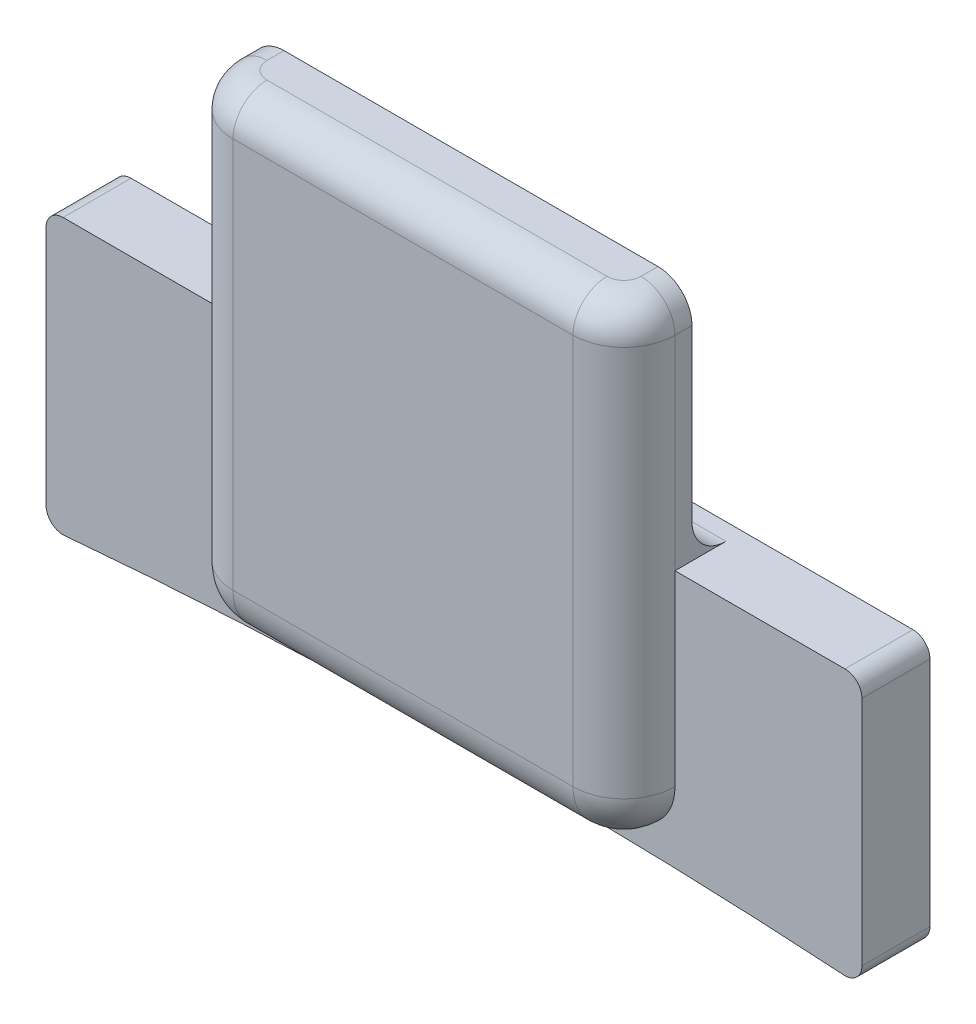
ISO-10303-21;
HEADER;
FILE_DESCRIPTION(('STEP AP214'),'2;1');
FILE_NAME('part.step','',(''),(''),'','','');
FILE_SCHEMA(('AUTOMOTIVE_DESIGN { 1 0 10303 214 1 1 1 1 }'));
ENDSEC;
DATA;
#1=APPLICATION_CONTEXT('core data for automotive mechanical design processes');
#2=APPLICATION_PROTOCOL_DEFINITION('international standard','automotive_design',2000,#1);
#3=PRODUCT_CONTEXT('',#1,'mechanical');
#4=PRODUCT('Part','Part','',(#3));
#5=PRODUCT_RELATED_PRODUCT_CATEGORY('part','',(#4));
#6=PRODUCT_DEFINITION_FORMATION('','',#4);
#7=PRODUCT_DEFINITION_CONTEXT('part definition',#1,'design');
#8=PRODUCT_DEFINITION('design','',#6,#7);
#9=PRODUCT_DEFINITION_SHAPE('','',#8);
#10=(LENGTH_UNIT() NAMED_UNIT(*) SI_UNIT(.MILLI.,.METRE.));
#11=(NAMED_UNIT(*) PLANE_ANGLE_UNIT() SI_UNIT($,.RADIAN.));
#12=(NAMED_UNIT(*) SI_UNIT($,.STERADIAN.) SOLID_ANGLE_UNIT());
#13=UNCERTAINTY_MEASURE_WITH_UNIT(LENGTH_MEASURE(1.E-05),#10,'distance_accuracy_value','');
#14=(GEOMETRIC_REPRESENTATION_CONTEXT(3) GLOBAL_UNCERTAINTY_ASSIGNED_CONTEXT((#13)) GLOBAL_UNIT_ASSIGNED_CONTEXT((#10,
#11,#12)) REPRESENTATION_CONTEXT('',''));
#15=CARTESIAN_POINT('',(0.,0.,0.));
#16=DIRECTION('',(0.,0.,1.));
#17=DIRECTION('',(1.,0.,0.));
#18=AXIS2_PLACEMENT_3D('',#15,#16,#17);
#19=CARTESIAN_POINT('',(-27.5000000737673,0.,4.));
#20=DIRECTION('',(0.,1.,0.));
#21=DIRECTION('',(-1.,0.,0.));
#22=AXIS2_PLACEMENT_3D('',#19,#20,#21);
#23=PLANE('',#22);
#24=DIRECTION('',(0.,0.,1.));
#25=VECTOR('',#24,1.);
#26=CARTESIAN_POINT('',(-16.5000000737673,0.,4.));
#27=LINE('',#26,#25);
#28=CARTESIAN_POINT('',(-16.5000000737673,0.,1.));
#29=VERTEX_POINT('',#28);
#30=CARTESIAN_POINT('',(-16.5000000737673,0.,4.));
#31=VERTEX_POINT('',#30);
#32=EDGE_CURVE('E49',#29,#31,#27,.T.);
#33=ORIENTED_EDGE('',*,*,#32,.F.);
#34=DIRECTION('',(-1.,0.,0.));
#35=VECTOR('',#34,1.);
#36=CARTESIAN_POINT('',(-27.5000000737673,0.,1.));
#37=LINE('',#36,#35);
#38=CARTESIAN_POINT('',(9.49999992623273,0.,0.999999999999993));
#39=VERTEX_POINT('',#38);
#40=EDGE_CURVE('E204',#29,#39,#37,.F.);
#41=ORIENTED_EDGE('',*,*,#40,.T.);
#42=DIRECTION('',(0.,0.,-1.));
#43=VECTOR('',#42,1.);
#44=CARTESIAN_POINT('',(9.49999992623272,0.,2.99999999999999));
#45=LINE('',#44,#43);
#46=CARTESIAN_POINT('',(9.49999992623272,0.,4.));
#47=VERTEX_POINT('',#46);
#48=EDGE_CURVE('E56',#47,#39,#45,.T.);
#49=ORIENTED_EDGE('',*,*,#48,.F.);
#50=DIRECTION('',(1.,0.,0.));
#51=VECTOR('',#50,1.);
#52=CARTESIAN_POINT('',(-27.5000000737673,0.,4.));
#53=LINE('',#52,#51);
#54=CARTESIAN_POINT('',(19.4999999262327,0.,4.));
#55=VERTEX_POINT('',#54);
#56=EDGE_CURVE('E184',#47,#55,#53,.T.);
#57=ORIENTED_EDGE('',*,*,#56,.T.);
#58=DIRECTION('',(0.,0.,-1.));
#59=VECTOR('',#58,1.);
#60=CARTESIAN_POINT('',(19.4999999262327,0.,4.));
#61=LINE('',#60,#59);
#62=CARTESIAN_POINT('',(19.4999999262327,0.,0.));
#63=VERTEX_POINT('',#62);
#64=EDGE_CURVE('E327',#55,#63,#61,.T.);
#65=ORIENTED_EDGE('',*,*,#64,.T.);
#66=DIRECTION('',(1.,0.,0.));
#67=VECTOR('',#66,1.);
#68=CARTESIAN_POINT('',(-27.5000000737673,0.,0.));
#69=LINE('',#68,#67);
#70=CARTESIAN_POINT('',(-26.5000000737673,0.,0.));
#71=VERTEX_POINT('',#70);
#72=EDGE_CURVE('E568',#71,#63,#69,.T.);
#73=ORIENTED_EDGE('',*,*,#72,.F.);
#74=DIRECTION('',(0.,0.,-1.));
#75=VECTOR('',#74,1.);
#76=CARTESIAN_POINT('',(-26.5000000737673,0.,4.));
#77=LINE('',#76,#75);
#78=CARTESIAN_POINT('',(-26.5000000737673,0.,4.));
#79=VERTEX_POINT('',#78);
#80=EDGE_CURVE('E330',#71,#79,#77,.F.);
#81=ORIENTED_EDGE('',*,*,#80,.T.);
#82=EDGE_CURVE('E194',#79,#31,#53,.T.);
#83=ORIENTED_EDGE('',*,*,#82,.T.);
#84=EDGE_LOOP('',(#33,#41,#49,#57,#65,#73,#81,#83));
#85=FACE_BOUND('',#84,.T.);
#86=ADVANCED_FACE('F34',(#85),#23,.T.);
#87=CARTESIAN_POINT('',(-1.09287578986539E-12,-315.000000000012,4.));
#88=DIRECTION('',(0.,0.,-1.));
#89=DIRECTION('',(-1.,0.,0.));
#90=AXIS2_PLACEMENT_3D('',#87,#88,#89);
#91=CYLINDRICAL_SURFACE('',#90,299.999999999988);
#92=CARTESIAN_POINT('',(-1.09287578986539E-12,-315.000000000012,0.));
#93=DIRECTION('',(0.,0.,1.));
#94=DIRECTION('',(1.,0.,0.));
#95=AXIS2_PLACEMENT_3D('',#92,#93,#94);
#96=CIRCLE('',#95,299.999999999988);
#97=CARTESIAN_POINT('',(19.4352158733216,-15.6302079635571,0.));
#98=VERTEX_POINT('',#97);
#99=CARTESIAN_POINT('',(-26.4119602064126,-16.1649144460432,0.));
#100=VERTEX_POINT('',#99);
#101=EDGE_CURVE('E200',#98,#100,#96,.T.);
#102=ORIENTED_EDGE('',*,*,#101,.F.);
#103=DIRECTION('',(0.,0.,-1.));
#104=VECTOR('',#103,1.);
#105=CARTESIAN_POINT('',(19.4352158733216,-15.6302079635571,4.));
#106=LINE('',#105,#104);
#107=CARTESIAN_POINT('',(19.4352158733216,-15.6302079635571,4.));
#108=VERTEX_POINT('',#107);
#109=EDGE_CURVE('E585',#98,#108,#106,.F.);
#110=ORIENTED_EDGE('',*,*,#109,.T.);
#111=CARTESIAN_POINT('',(-1.09287578986539E-12,-315.000000000012,4.));
#112=DIRECTION('',(0.,0.,1.));
#113=DIRECTION('',(1.,0.,0.));
#114=AXIS2_PLACEMENT_3D('',#111,#112,#113);
#115=CIRCLE('',#114,299.999999999988);
#116=CARTESIAN_POINT('',(-26.4119602064126,-16.1649144460432,4.));
#117=VERTEX_POINT('',#116);
#118=EDGE_CURVE('E263',#108,#117,#115,.T.);
#119=ORIENTED_EDGE('',*,*,#118,.T.);
#120=DIRECTION('',(0.,0.,-1.));
#121=VECTOR('',#120,1.);
#122=CARTESIAN_POINT('',(-26.4119602064126,-16.1649144460431,4.));
#123=LINE('',#122,#121);
#124=EDGE_CURVE('E613',#117,#100,#123,.T.);
#125=ORIENTED_EDGE('',*,*,#124,.T.);
#126=EDGE_LOOP('',(#102,#110,#119,#125));
#127=FACE_BOUND('',#126,.T.);
#128=ADVANCED_FACE('F358',(#127),#91,.F.);
#129=CARTESIAN_POINT('',(20.4999999262327,0.,4.));
#130=DIRECTION('',(1.,0.,0.));
#131=DIRECTION('',(0.,1.,0.));
#132=AXIS2_PLACEMENT_3D('',#129,#130,#131);
#133=PLANE('',#132);
#134=DIRECTION('',(0.,-1.,0.));
#135=VECTOR('',#134,1.);
#136=CARTESIAN_POINT('',(20.4999999262327,0.,4.));
#137=LINE('',#136,#135);
#138=CARTESIAN_POINT('',(20.4999999262327,-1.,4.));
#139=VERTEX_POINT('',#138);
#140=CARTESIAN_POINT('',(20.4999999262327,-14.6323086567688,4.));
#141=VERTEX_POINT('',#140);
#142=EDGE_CURVE('E579',#139,#141,#137,.T.);
#143=ORIENTED_EDGE('',*,*,#142,.T.);
#144=DIRECTION('',(0.,0.,-1.));
#145=VECTOR('',#144,1.);
#146=CARTESIAN_POINT('',(20.4999999262327,-14.6323086567688,4.));
#147=LINE('',#146,#145);
#148=CARTESIAN_POINT('',(20.4999999262327,-14.6323086567688,0.));
#149=VERTEX_POINT('',#148);
#150=EDGE_CURVE('E621',#141,#149,#147,.T.);
#151=ORIENTED_EDGE('',*,*,#150,.T.);
#152=DIRECTION('',(0.,-1.,0.));
#153=VECTOR('',#152,1.);
#154=CARTESIAN_POINT('',(20.4999999262327,0.,0.));
#155=LINE('',#154,#153);
#156=CARTESIAN_POINT('',(20.4999999262327,-1.,0.));
#157=VERTEX_POINT('',#156);
#158=EDGE_CURVE('E559',#157,#149,#155,.T.);
#159=ORIENTED_EDGE('',*,*,#158,.F.);
#160=DIRECTION('',(0.,0.,-1.));
#161=VECTOR('',#160,1.);
#162=CARTESIAN_POINT('',(20.4999999262327,-1.,4.));
#163=LINE('',#162,#161);
#164=EDGE_CURVE('E623',#157,#139,#163,.F.);
#165=ORIENTED_EDGE('',*,*,#164,.T.);
#166=EDGE_LOOP('',(#143,#151,#159,#165));
#167=FACE_BOUND('',#166,.T.);
#168=ADVANCED_FACE('F365',(#167),#133,.T.);
#169=CARTESIAN_POINT('',(-27.5000000737673,-16.2630756067663,4.));
#170=DIRECTION('',(-1.,0.,0.));
#171=DIRECTION('',(0.,0.,1.));
#172=AXIS2_PLACEMENT_3D('',#169,#170,#171);
#173=PLANE('',#172);
#174=DIRECTION('',(0.,1.,0.));
#175=VECTOR('',#174,1.);
#176=CARTESIAN_POINT('',(-27.5000000737673,-16.2630756067663,0.));
#177=LINE('',#176,#175);
#178=CARTESIAN_POINT('',(-27.5000000737673,-15.1687974941966,0.));
#179=VERTEX_POINT('',#178);
#180=CARTESIAN_POINT('',(-27.5000000737673,-0.999999999999994,0.));
#181=VERTEX_POINT('',#180);
#182=EDGE_CURVE('E571',#179,#181,#177,.T.);
#183=ORIENTED_EDGE('',*,*,#182,.F.);
#184=DIRECTION('',(0.,0.,-1.));
#185=VECTOR('',#184,1.);
#186=CARTESIAN_POINT('',(-27.5000000737673,-15.1687974941966,4.));
#187=LINE('',#186,#185);
#188=CARTESIAN_POINT('',(-27.5000000737673,-15.1687974941966,4.));
#189=VERTEX_POINT('',#188);
#190=EDGE_CURVE('E597',#179,#189,#187,.F.);
#191=ORIENTED_EDGE('',*,*,#190,.T.);
#192=DIRECTION('',(0.,1.,0.));
#193=VECTOR('',#192,1.);
#194=CARTESIAN_POINT('',(-27.5000000737673,-16.2630756067663,4.));
#195=LINE('',#194,#193);
#196=CARTESIAN_POINT('',(-27.5000000737673,-0.999999999999994,4.));
#197=VERTEX_POINT('',#196);
#198=EDGE_CURVE('E195',#189,#197,#195,.T.);
#199=ORIENTED_EDGE('',*,*,#198,.T.);
#200=DIRECTION('',(0.,0.,-1.));
#201=VECTOR('',#200,1.);
#202=CARTESIAN_POINT('',(-27.5000000737673,-0.999999999999994,4.));
#203=LINE('',#202,#201);
#204=EDGE_CURVE('E594',#197,#181,#203,.T.);
#205=ORIENTED_EDGE('',*,*,#204,.T.);
#206=EDGE_LOOP('',(#183,#191,#199,#205));
#207=FACE_BOUND('',#206,.T.);
#208=ADVANCED_FACE('F371',(#207),#173,.T.);
#209=CARTESIAN_POINT('',(-1.09287578986539E-12,-315.000000000012,4.));
#210=DIRECTION('',(0.,0.,1.));
#211=DIRECTION('',(1.,0.,0.));
#212=AXIS2_PLACEMENT_3D('',#209,#210,#211);
#213=PLANE('',#212);
#214=ORIENTED_EDGE('',*,*,#118,.F.);
#215=CARTESIAN_POINT('',(19.4999999262327,-14.6323086567688,4.));
#216=DIRECTION('',(0.,0.,1.));
#217=DIRECTION('',(1.,0.,0.));
#218=AXIS2_PLACEMENT_3D('',#215,#216,#217);
#219=CIRCLE('',#218,1.);
#220=EDGE_CURVE('E592',#108,#141,#219,.T.);
#221=ORIENTED_EDGE('',*,*,#220,.T.);
#222=ORIENTED_EDGE('',*,*,#142,.F.);
#223=CARTESIAN_POINT('',(19.4999999262327,-1.,4.));
#224=DIRECTION('',(0.,0.,1.));
#225=DIRECTION('',(1.,0.,0.));
#226=AXIS2_PLACEMENT_3D('',#223,#224,#225);
#227=CIRCLE('',#226,1.);
#228=EDGE_CURVE('E191',#139,#55,#227,.T.);
#229=ORIENTED_EDGE('',*,*,#228,.T.);
#230=ORIENTED_EDGE('',*,*,#56,.F.);
#231=DIRECTION('',(0.,1.,0.));
#232=VECTOR('',#231,1.);
#233=CARTESIAN_POINT('',(9.49999992623272,0.,4.));
#234=LINE('',#233,#232);
#235=CARTESIAN_POINT('',(9.49999992623272,-11.,4.));
#236=VERTEX_POINT('',#235);
#237=EDGE_CURVE('E187',#236,#47,#234,.T.);
#238=ORIENTED_EDGE('',*,*,#237,.F.);
#239=CARTESIAN_POINT('',(6.49999992623272,-11.,4.));
#240=DIRECTION('',(0.,0.,1.));
#241=DIRECTION('',(1.,0.,0.));
#242=AXIS2_PLACEMENT_3D('',#239,#240,#241);
#243=CIRCLE('',#242,3.);
#244=CARTESIAN_POINT('',(6.49999992623272,-14.,4.));
#245=VERTEX_POINT('',#244);
#246=EDGE_CURVE('E215',#236,#245,#243,.F.);
#247=ORIENTED_EDGE('',*,*,#246,.T.);
#248=DIRECTION('',(1.,0.,0.));
#249=VECTOR('',#248,1.);
#250=CARTESIAN_POINT('',(9.49999992623272,-14.,4.));
#251=LINE('',#250,#249);
#252=CARTESIAN_POINT('',(-13.5000000737673,-14.,4.));
#253=VERTEX_POINT('',#252);
#254=EDGE_CURVE('E201',#253,#245,#251,.T.);
#255=ORIENTED_EDGE('',*,*,#254,.F.);
#256=CARTESIAN_POINT('',(-13.5000000737673,-11.,4.));
#257=DIRECTION('',(0.,0.,1.));
#258=DIRECTION('',(1.,0.,0.));
#259=AXIS2_PLACEMENT_3D('',#256,#257,#258);
#260=CIRCLE('',#259,3.);
#261=CARTESIAN_POINT('',(-16.5000000737673,-11.,4.));
#262=VERTEX_POINT('',#261);
#263=EDGE_CURVE('E269',#253,#262,#260,.F.);
#264=ORIENTED_EDGE('',*,*,#263,.T.);
#265=DIRECTION('',(0.,-1.,0.));
#266=VECTOR('',#265,1.);
#267=CARTESIAN_POINT('',(-16.5000000737673,-14.,4.));
#268=LINE('',#267,#266);
#269=EDGE_CURVE('E178',#31,#262,#268,.T.);
#270=ORIENTED_EDGE('',*,*,#269,.F.);
#271=ORIENTED_EDGE('',*,*,#82,.F.);
#272=CARTESIAN_POINT('',(-26.5000000737673,-0.999999999999994,4.));
#273=DIRECTION('',(0.,0.,1.));
#274=DIRECTION('',(1.,0.,0.));
#275=AXIS2_PLACEMENT_3D('',#272,#273,#274);
#276=CIRCLE('',#275,1.);
#277=EDGE_CURVE('E587',#79,#197,#276,.T.);
#278=ORIENTED_EDGE('',*,*,#277,.T.);
#279=ORIENTED_EDGE('',*,*,#198,.F.);
#280=CARTESIAN_POINT('',(-26.5000000737673,-15.1687974941966,4.));
#281=DIRECTION('',(0.,0.,1.));
#282=DIRECTION('',(1.,0.,0.));
#283=AXIS2_PLACEMENT_3D('',#280,#281,#282);
#284=CIRCLE('',#283,1.);
#285=EDGE_CURVE('E590',#189,#117,#284,.T.);
#286=ORIENTED_EDGE('',*,*,#285,.T.);
#287=EDGE_LOOP('',(#214,#221,#222,#229,#230,#238,#247,#255,#264,#270,#271,#278,#279,#286));
#288=FACE_BOUND('',#287,.T.);
#289=ADVANCED_FACE('F186',(#288),#213,.T.);
#290=CARTESIAN_POINT('',(-1.09287578986539E-12,-315.000000000012,0.));
#291=DIRECTION('',(0.,0.,1.));
#292=DIRECTION('',(1.,0.,0.));
#293=AXIS2_PLACEMENT_3D('',#290,#291,#292);
#294=PLANE('',#293);
#295=ORIENTED_EDGE('',*,*,#158,.T.);
#296=CARTESIAN_POINT('',(19.4999999262327,-14.6323086567688,0.));
#297=DIRECTION('',(0.,0.,1.));
#298=DIRECTION('',(1.,0.,0.));
#299=AXIS2_PLACEMENT_3D('',#296,#297,#298);
#300=CIRCLE('',#299,1.);
#301=EDGE_CURVE('E561',#149,#98,#300,.F.);
#302=ORIENTED_EDGE('',*,*,#301,.T.);
#303=ORIENTED_EDGE('',*,*,#101,.T.);
#304=CARTESIAN_POINT('',(-26.5000000737673,-15.1687974941966,0.));
#305=DIRECTION('',(0.,0.,1.));
#306=DIRECTION('',(1.,0.,0.));
#307=AXIS2_PLACEMENT_3D('',#304,#305,#306);
#308=CIRCLE('',#307,1.);
#309=EDGE_CURVE('E609',#100,#179,#308,.F.);
#310=ORIENTED_EDGE('',*,*,#309,.T.);
#311=ORIENTED_EDGE('',*,*,#182,.T.);
#312=CARTESIAN_POINT('',(-26.5000000737673,-0.999999999999994,0.));
#313=DIRECTION('',(0.,0.,1.));
#314=DIRECTION('',(1.,0.,0.));
#315=AXIS2_PLACEMENT_3D('',#312,#313,#314);
#316=CIRCLE('',#315,1.);
#317=EDGE_CURVE('E605',#181,#71,#316,.F.);
#318=ORIENTED_EDGE('',*,*,#317,.T.);
#319=ORIENTED_EDGE('',*,*,#72,.T.);
#320=CARTESIAN_POINT('',(19.4999999262327,-1.,0.));
#321=DIRECTION('',(0.,0.,1.));
#322=DIRECTION('',(1.,0.,0.));
#323=AXIS2_PLACEMENT_3D('',#320,#321,#322);
#324=CIRCLE('',#323,1.);
#325=EDGE_CURVE('E564',#63,#157,#324,.F.);
#326=ORIENTED_EDGE('',*,*,#325,.T.);
#327=EDGE_LOOP('',(#295,#302,#303,#310,#311,#318,#319,#326));
#328=FACE_BOUND('',#327,.T.);
#329=ADVANCED_FACE('F431',(#328),#294,.F.);
#330=CARTESIAN_POINT('',(0.,0.,7.));
#331=DIRECTION('',(0.,0.,-1.));
#332=DIRECTION('',(-1.,0.,0.));
#333=AXIS2_PLACEMENT_3D('',#330,#331,#332);
#334=PLANE('',#333);
#335=DIRECTION('',(0.,1.,0.));
#336=VECTOR('',#335,1.);
#337=CARTESIAN_POINT('',(6.49999992623272,0.,7.));
#338=LINE('',#337,#336);
#339=CARTESIAN_POINT('',(6.49999992623272,-11.,7.));
#340=VERTEX_POINT('',#339);
#341=CARTESIAN_POINT('',(6.49999992623272,12.,7.));
#342=VERTEX_POINT('',#341);
#343=EDGE_CURVE('E321',#340,#342,#338,.T.);
#344=ORIENTED_EDGE('',*,*,#343,.T.);
#345=DIRECTION('',(1.,0.,0.));
#346=VECTOR('',#345,1.);
#347=CARTESIAN_POINT('',(0.,12.,7.));
#348=LINE('',#347,#346);
#349=CARTESIAN_POINT('',(-13.5000000737673,12.,7.));
#350=VERTEX_POINT('',#349);
#351=EDGE_CURVE('E228',#342,#350,#348,.F.);
#352=ORIENTED_EDGE('',*,*,#351,.T.);
#353=DIRECTION('',(0.,-1.,0.));
#354=VECTOR('',#353,1.);
#355=CARTESIAN_POINT('',(-13.5000000737673,0.,7.));
#356=LINE('',#355,#354);
#357=CARTESIAN_POINT('',(-13.5000000737673,-11.,7.));
#358=VERTEX_POINT('',#357);
#359=EDGE_CURVE('E301',#350,#358,#356,.T.);
#360=ORIENTED_EDGE('',*,*,#359,.T.);
#361=DIRECTION('',(1.,0.,0.));
#362=VECTOR('',#361,1.);
#363=CARTESIAN_POINT('',(0.,-11.,7.));
#364=LINE('',#363,#362);
#365=EDGE_CURVE('E326',#358,#340,#364,.T.);
#366=ORIENTED_EDGE('',*,*,#365,.T.);
#367=EDGE_LOOP('',(#344,#352,#360,#366));
#368=FACE_BOUND('',#367,.T.);
#369=ADVANCED_FACE('F324',(#368),#334,.F.);
#370=CARTESIAN_POINT('',(19.4999999262327,-14.6323086567688,4.));
#371=DIRECTION('',(0.,0.,-1.));
#372=DIRECTION('',(-1.,0.,0.));
#373=AXIS2_PLACEMENT_3D('',#370,#371,#372);
#374=CYLINDRICAL_SURFACE('',#373,1.);
#375=ORIENTED_EDGE('',*,*,#220,.F.);
#376=ORIENTED_EDGE('',*,*,#109,.F.);
#377=ORIENTED_EDGE('',*,*,#301,.F.);
#378=ORIENTED_EDGE('',*,*,#150,.F.);
#379=EDGE_LOOP('',(#375,#376,#377,#378));
#380=FACE_BOUND('',#379,.T.);
#381=ADVANCED_FACE('F375',(#380),#374,.T.);
#382=CARTESIAN_POINT('',(-26.5000000737673,-15.1687974941966,4.));
#383=DIRECTION('',(0.,0.,-1.));
#384=DIRECTION('',(-1.,0.,0.));
#385=AXIS2_PLACEMENT_3D('',#382,#383,#384);
#386=CYLINDRICAL_SURFACE('',#385,1.);
#387=ORIENTED_EDGE('',*,*,#285,.F.);
#388=ORIENTED_EDGE('',*,*,#190,.F.);
#389=ORIENTED_EDGE('',*,*,#309,.F.);
#390=ORIENTED_EDGE('',*,*,#124,.F.);
#391=EDGE_LOOP('',(#387,#388,#389,#390));
#392=FACE_BOUND('',#391,.T.);
#393=ADVANCED_FACE('F378',(#392),#386,.T.);
#394=CARTESIAN_POINT('',(19.4999999262327,-1.,4.));
#395=DIRECTION('',(0.,0.,-1.));
#396=DIRECTION('',(-1.,0.,0.));
#397=AXIS2_PLACEMENT_3D('',#394,#395,#396);
#398=CYLINDRICAL_SURFACE('',#397,1.);
#399=ORIENTED_EDGE('',*,*,#228,.F.);
#400=ORIENTED_EDGE('',*,*,#164,.F.);
#401=ORIENTED_EDGE('',*,*,#325,.F.);
#402=ORIENTED_EDGE('',*,*,#64,.F.);
#403=EDGE_LOOP('',(#399,#400,#401,#402));
#404=FACE_BOUND('',#403,.T.);
#405=ADVANCED_FACE('F382',(#404),#398,.T.);
#406=CARTESIAN_POINT('',(-26.5000000737673,-0.999999999999994,4.));
#407=DIRECTION('',(0.,0.,-1.));
#408=DIRECTION('',(-1.,0.,0.));
#409=AXIS2_PLACEMENT_3D('',#406,#407,#408);
#410=CYLINDRICAL_SURFACE('',#409,1.);
#411=ORIENTED_EDGE('',*,*,#277,.F.);
#412=ORIENTED_EDGE('',*,*,#80,.F.);
#413=ORIENTED_EDGE('',*,*,#317,.F.);
#414=ORIENTED_EDGE('',*,*,#204,.F.);
#415=EDGE_LOOP('',(#411,#412,#413,#414));
#416=FACE_BOUND('',#415,.T.);
#417=ADVANCED_FACE('F386',(#416),#410,.T.);
#418=CARTESIAN_POINT('',(-13.5000000737673,0.,4.));
#419=DIRECTION('',(0.,-1.,0.));
#420=DIRECTION('',(0.,0.,-1.));
#421=AXIS2_PLACEMENT_3D('',#418,#419,#420);
#422=CYLINDRICAL_SURFACE('',#421,3.);
#423=ORIENTED_EDGE('',*,*,#359,.F.);
#424=CARTESIAN_POINT('',(-13.5000000737673,12.,4.));
#425=DIRECTION('',(0.,-1.,0.));
#426=DIRECTION('',(1.,0.,0.));
#427=AXIS2_PLACEMENT_3D('',#424,#425,#426);
#428=CIRCLE('',#427,3.);
#429=CARTESIAN_POINT('',(-16.5000000737673,12.,4.));
#430=VERTEX_POINT('',#429);
#431=EDGE_CURVE('E223',#350,#430,#428,.T.);
#432=ORIENTED_EDGE('',*,*,#431,.T.);
#433=DIRECTION('',(0.,-1.,0.));
#434=VECTOR('',#433,1.);
#435=CARTESIAN_POINT('',(-16.5000000737673,14.,4.));
#436=LINE('',#435,#434);
#437=EDGE_CURVE('E255',#430,#31,#436,.T.);
#438=ORIENTED_EDGE('',*,*,#437,.T.);
#439=ORIENTED_EDGE('',*,*,#269,.T.);
#440=CARTESIAN_POINT('',(-13.5000000737673,-11.,4.));
#441=DIRECTION('',(0.,-1.,0.));
#442=DIRECTION('',(0.,0.,-1.));
#443=AXIS2_PLACEMENT_3D('',#440,#441,#442);
#444=CIRCLE('',#443,3.);
#445=EDGE_CURVE('E267',#262,#358,#444,.F.);
#446=ORIENTED_EDGE('',*,*,#445,.T.);
#447=EDGE_LOOP('',(#423,#432,#438,#439,#446));
#448=FACE_BOUND('',#447,.T.);
#449=ADVANCED_FACE('F299',(#448),#422,.T.);
#450=CARTESIAN_POINT('',(6.49999992623272,0.,4.));
#451=DIRECTION('',(0.,1.,0.));
#452=DIRECTION('',(-1.,0.,0.));
#453=AXIS2_PLACEMENT_3D('',#450,#451,#452);
#454=CYLINDRICAL_SURFACE('',#453,3.);
#455=DIRECTION('',(0.,-1.,0.));
#456=VECTOR('',#455,1.);
#457=CARTESIAN_POINT('',(9.49999992623272,14.,4.));
#458=LINE('',#457,#456);
#459=CARTESIAN_POINT('',(9.49999992623272,12.,4.));
#460=VERTEX_POINT('',#459);
#461=EDGE_CURVE('E169',#460,#47,#458,.T.);
#462=ORIENTED_EDGE('',*,*,#461,.F.);
#463=CARTESIAN_POINT('',(6.49999992623272,12.,4.));
#464=DIRECTION('',(0.,-1.,0.));
#465=DIRECTION('',(1.,0.,0.));
#466=AXIS2_PLACEMENT_3D('',#463,#464,#465);
#467=CIRCLE('',#466,3.);
#468=EDGE_CURVE('E226',#460,#342,#467,.T.);
#469=ORIENTED_EDGE('',*,*,#468,.T.);
#470=ORIENTED_EDGE('',*,*,#343,.F.);
#471=CARTESIAN_POINT('',(6.49999992623272,-11.,4.));
#472=DIRECTION('',(0.,1.,0.));
#473=DIRECTION('',(-1.,0.,0.));
#474=AXIS2_PLACEMENT_3D('',#471,#472,#473);
#475=CIRCLE('',#474,3.);
#476=EDGE_CURVE('E199',#340,#236,#475,.T.);
#477=ORIENTED_EDGE('',*,*,#476,.T.);
#478=ORIENTED_EDGE('',*,*,#237,.T.);
#479=EDGE_LOOP('',(#462,#469,#470,#477,#478));
#480=FACE_BOUND('',#479,.T.);
#481=ADVANCED_FACE('F197',(#480),#454,.T.);
#482=CARTESIAN_POINT('',(0.,-11.,4.));
#483=DIRECTION('',(1.,0.,0.));
#484=DIRECTION('',(0.,1.,0.));
#485=AXIS2_PLACEMENT_3D('',#482,#483,#484);
#486=CYLINDRICAL_SURFACE('',#485,3.);
#487=ORIENTED_EDGE('',*,*,#365,.F.);
#488=CARTESIAN_POINT('',(-13.5000000737673,-11.,4.));
#489=DIRECTION('',(1.,0.,0.));
#490=DIRECTION('',(0.,1.,0.));
#491=AXIS2_PLACEMENT_3D('',#488,#489,#490);
#492=CIRCLE('',#491,3.);
#493=EDGE_CURVE('E337',#358,#253,#492,.T.);
#494=ORIENTED_EDGE('',*,*,#493,.T.);
#495=ORIENTED_EDGE('',*,*,#254,.T.);
#496=CARTESIAN_POINT('',(6.49999992623272,-11.,4.));
#497=DIRECTION('',(1.,0.,0.));
#498=DIRECTION('',(0.,1.,0.));
#499=AXIS2_PLACEMENT_3D('',#496,#497,#498);
#500=CIRCLE('',#499,3.);
#501=EDGE_CURVE('E335',#245,#340,#500,.F.);
#502=ORIENTED_EDGE('',*,*,#501,.T.);
#503=EDGE_LOOP('',(#487,#494,#495,#502));
#504=FACE_BOUND('',#503,.T.);
#505=ADVANCED_FACE('F343',(#504),#486,.T.);
#506=CARTESIAN_POINT('',(-13.5000000737673,-11.,4.));
#507=DIRECTION('',(0.,0.,1.));
#508=DIRECTION('',(1.,0.,0.));
#509=AXIS2_PLACEMENT_3D('',#506,#507,#508);
#510=SPHERICAL_SURFACE('',#509,3.);
#511=ORIENTED_EDGE('',*,*,#493,.F.);
#512=ORIENTED_EDGE('',*,*,#445,.F.);
#513=ORIENTED_EDGE('',*,*,#263,.F.);
#514=EDGE_LOOP('',(#511,#512,#513));
#515=FACE_BOUND('',#514,.T.);
#516=ADVANCED_FACE('F345',(#515),#510,.T.);
#517=CARTESIAN_POINT('',(6.49999992623272,-11.,4.));
#518=DIRECTION('',(0.,0.,1.));
#519=DIRECTION('',(1.,0.,0.));
#520=AXIS2_PLACEMENT_3D('',#517,#518,#519);
#521=SPHERICAL_SURFACE('',#520,3.);
#522=ORIENTED_EDGE('',*,*,#246,.F.);
#523=ORIENTED_EDGE('',*,*,#476,.F.);
#524=ORIENTED_EDGE('',*,*,#501,.F.);
#525=EDGE_LOOP('',(#522,#523,#524));
#526=FACE_BOUND('',#525,.T.);
#527=ADVANCED_FACE('F347',(#526),#521,.T.);
#528=CARTESIAN_POINT('',(9.49999992623272,14.,2.99999999999999));
#529=DIRECTION('',(-1.,0.,0.));
#530=DIRECTION('',(0.,0.,1.));
#531=AXIS2_PLACEMENT_3D('',#528,#529,#530);
#532=PLANE('',#531);
#533=DIRECTION('',(0.,-1.,0.));
#534=VECTOR('',#533,1.);
#535=CARTESIAN_POINT('',(9.49999992623272,14.,2.99999999999999));
#536=LINE('',#535,#534);
#537=CARTESIAN_POINT('',(9.49999992623272,12.,2.99999999999999));
#538=VERTEX_POINT('',#537);
#539=CARTESIAN_POINT('',(9.49999992623272,2.,2.99999999999999));
#540=VERTEX_POINT('',#539);
#541=EDGE_CURVE('E179',#538,#540,#536,.T.);
#542=ORIENTED_EDGE('',*,*,#541,.F.);
#543=DIRECTION('',(0.,0.,-1.));
#544=VECTOR('',#543,1.);
#545=CARTESIAN_POINT('',(9.49999992623272,12.,2.99999999999999));
#546=LINE('',#545,#544);
#547=EDGE_CURVE('E174',#538,#460,#546,.F.);
#548=ORIENTED_EDGE('',*,*,#547,.T.);
#549=ORIENTED_EDGE('',*,*,#461,.T.);
#550=ORIENTED_EDGE('',*,*,#48,.T.);
#551=CARTESIAN_POINT('',(9.49999992623273,2.,0.999999999999993));
#552=DIRECTION('',(-1.,0.,0.));
#553=DIRECTION('',(0.,0.,1.));
#554=AXIS2_PLACEMENT_3D('',#551,#552,#553);
#555=CIRCLE('',#554,2.);
#556=EDGE_CURVE('E11',#39,#540,#555,.T.);
#557=ORIENTED_EDGE('',*,*,#556,.T.);
#558=EDGE_LOOP('',(#542,#548,#549,#550,#557));
#559=FACE_BOUND('',#558,.T.);
#560=ADVANCED_FACE('F172',(#559),#532,.F.);
#561=CARTESIAN_POINT('',(-16.5000000737673,14.,3.));
#562=DIRECTION('',(0.,0.,1.));
#563=DIRECTION('',(1.,0.,0.));
#564=AXIS2_PLACEMENT_3D('',#561,#562,#563);
#565=PLANE('',#564);
#566=ORIENTED_EDGE('',*,*,#541,.T.);
#567=DIRECTION('',(-1.,0.,0.));
#568=VECTOR('',#567,1.);
#569=CARTESIAN_POINT('',(-16.5000000737673,2.00000000000001,3.));
#570=LINE('',#569,#568);
#571=CARTESIAN_POINT('',(-16.5000000737673,2.00000000000001,3.));
#572=VERTEX_POINT('',#571);
#573=EDGE_CURVE('E230',#540,#572,#570,.T.);
#574=ORIENTED_EDGE('',*,*,#573,.T.);
#575=DIRECTION('',(0.,-1.,0.));
#576=VECTOR('',#575,1.);
#577=CARTESIAN_POINT('',(-16.5000000737673,14.,3.));
#578=LINE('',#577,#576);
#579=CARTESIAN_POINT('',(-16.5000000737673,12.,3.));
#580=VERTEX_POINT('',#579);
#581=EDGE_CURVE('E245',#580,#572,#578,.T.);
#582=ORIENTED_EDGE('',*,*,#581,.F.);
#583=CARTESIAN_POINT('',(-14.5000000737673,12.,3.));
#584=DIRECTION('',(0.,0.,1.));
#585=DIRECTION('',(1.,0.,0.));
#586=AXIS2_PLACEMENT_3D('',#583,#584,#585);
#587=CIRCLE('',#586,2.);
#588=CARTESIAN_POINT('',(-14.5000000737673,14.,3.));
#589=VERTEX_POINT('',#588);
#590=EDGE_CURVE('E293',#580,#589,#587,.F.);
#591=ORIENTED_EDGE('',*,*,#590,.T.);
#592=DIRECTION('',(-1.,0.,0.));
#593=VECTOR('',#592,1.);
#594=CARTESIAN_POINT('',(-16.5000000737673,14.,3.));
#595=LINE('',#594,#593);
#596=CARTESIAN_POINT('',(7.49999992623272,14.,2.99999999999999));
#597=VERTEX_POINT('',#596);
#598=EDGE_CURVE('E208',#597,#589,#595,.T.);
#599=ORIENTED_EDGE('',*,*,#598,.F.);
#600=CARTESIAN_POINT('',(7.49999992623272,12.,2.99999999999999));
#601=DIRECTION('',(0.,0.,1.));
#602=DIRECTION('',(1.,0.,0.));
#603=AXIS2_PLACEMENT_3D('',#600,#601,#602);
#604=CIRCLE('',#603,2.);
#605=EDGE_CURVE('E253',#597,#538,#604,.F.);
#606=ORIENTED_EDGE('',*,*,#605,.T.);
#607=EDGE_LOOP('',(#566,#574,#582,#591,#599,#606));
#608=FACE_BOUND('',#607,.T.);
#609=ADVANCED_FACE('F250',(#608),#565,.F.);
#610=CARTESIAN_POINT('',(-16.5000000737673,14.,4.));
#611=DIRECTION('',(1.,0.,0.));
#612=DIRECTION('',(0.,1.,0.));
#613=AXIS2_PLACEMENT_3D('',#610,#611,#612);
#614=PLANE('',#613);
#615=ORIENTED_EDGE('',*,*,#437,.F.);
#616=DIRECTION('',(0.,0.,1.));
#617=VECTOR('',#616,1.);
#618=CARTESIAN_POINT('',(-16.5000000737673,12.,4.));
#619=LINE('',#618,#617);
#620=EDGE_CURVE('E290',#430,#580,#619,.F.);
#621=ORIENTED_EDGE('',*,*,#620,.T.);
#622=ORIENTED_EDGE('',*,*,#581,.T.);
#623=CARTESIAN_POINT('',(-16.5000000737673,2.00000000000001,1.));
#624=DIRECTION('',(1.,0.,0.));
#625=DIRECTION('',(0.,1.,0.));
#626=AXIS2_PLACEMENT_3D('',#623,#624,#625);
#627=CIRCLE('',#626,2.);
#628=EDGE_CURVE('E42',#572,#29,#627,.T.);
#629=ORIENTED_EDGE('',*,*,#628,.T.);
#630=ORIENTED_EDGE('',*,*,#32,.T.);
#631=EDGE_LOOP('',(#615,#621,#622,#629,#630));
#632=FACE_BOUND('',#631,.T.);
#633=ADVANCED_FACE('F243',(#632),#614,.F.);
#634=CARTESIAN_POINT('',(6.49999992623272,14.,4.));
#635=DIRECTION('',(0.,-1.,0.));
#636=DIRECTION('',(1.,0.,0.));
#637=AXIS2_PLACEMENT_3D('',#634,#635,#636);
#638=PLANE('',#637);
#639=ORIENTED_EDGE('',*,*,#598,.T.);
#640=DIRECTION('',(0.,0.,1.));
#641=VECTOR('',#640,1.);
#642=CARTESIAN_POINT('',(-14.5000000737673,14.,4.));
#643=LINE('',#642,#641);
#644=CARTESIAN_POINT('',(-14.5000000737673,14.,4.));
#645=VERTEX_POINT('',#644);
#646=EDGE_CURVE('E287',#589,#645,#643,.T.);
#647=ORIENTED_EDGE('',*,*,#646,.T.);
#648=CARTESIAN_POINT('',(-13.5000000737673,14.,4.));
#649=DIRECTION('',(0.,-1.,0.));
#650=DIRECTION('',(1.,0.,0.));
#651=AXIS2_PLACEMENT_3D('',#648,#649,#650);
#652=CIRCLE('',#651,1.);
#653=CARTESIAN_POINT('',(-13.5000000737673,14.,5.));
#654=VERTEX_POINT('',#653);
#655=EDGE_CURVE('E285',#645,#654,#652,.F.);
#656=ORIENTED_EDGE('',*,*,#655,.T.);
#657=DIRECTION('',(1.,0.,0.));
#658=VECTOR('',#657,1.);
#659=CARTESIAN_POINT('',(6.49999992623272,14.,5.));
#660=LINE('',#659,#658);
#661=CARTESIAN_POINT('',(6.49999992623272,14.,5.));
#662=VERTEX_POINT('',#661);
#663=EDGE_CURVE('E273',#654,#662,#660,.T.);
#664=ORIENTED_EDGE('',*,*,#663,.T.);
#665=CARTESIAN_POINT('',(6.49999992623272,14.,4.));
#666=DIRECTION('',(0.,-1.,0.));
#667=DIRECTION('',(1.,0.,0.));
#668=AXIS2_PLACEMENT_3D('',#665,#666,#667);
#669=CIRCLE('',#668,1.);
#670=CARTESIAN_POINT('',(7.49999992623272,14.,4.));
#671=VERTEX_POINT('',#670);
#672=EDGE_CURVE('E274',#662,#671,#669,.F.);
#673=ORIENTED_EDGE('',*,*,#672,.T.);
#674=DIRECTION('',(0.,0.,-1.));
#675=VECTOR('',#674,1.);
#676=CARTESIAN_POINT('',(7.49999992623272,14.,4.));
#677=LINE('',#676,#675);
#678=EDGE_CURVE('E279',#671,#597,#677,.T.);
#679=ORIENTED_EDGE('',*,*,#678,.T.);
#680=EDGE_LOOP('',(#639,#647,#656,#664,#673,#679));
#681=FACE_BOUND('',#680,.T.);
#682=ADVANCED_FACE('F311',(#681),#638,.F.);
#683=CARTESIAN_POINT('',(7.49999992623272,12.,4.));
#684=DIRECTION('',(0.,0.,-1.));
#685=DIRECTION('',(-1.,0.,0.));
#686=AXIS2_PLACEMENT_3D('',#683,#684,#685);
#687=CYLINDRICAL_SURFACE('',#686,2.);
#688=ORIENTED_EDGE('',*,*,#605,.F.);
#689=ORIENTED_EDGE('',*,*,#678,.F.);
#690=CARTESIAN_POINT('',(7.49999992623272,12.,4.));
#691=DIRECTION('',(0.,0.,1.));
#692=DIRECTION('',(1.,0.,0.));
#693=AXIS2_PLACEMENT_3D('',#690,#691,#692);
#694=CIRCLE('',#693,2.);
#695=EDGE_CURVE('E206',#460,#671,#694,.T.);
#696=ORIENTED_EDGE('',*,*,#695,.F.);
#697=ORIENTED_EDGE('',*,*,#547,.F.);
#698=EDGE_LOOP('',(#688,#689,#696,#697));
#699=FACE_BOUND('',#698,.T.);
#700=ADVANCED_FACE('F314',(#699),#687,.T.);
#701=CARTESIAN_POINT('',(6.49999992623272,12.,4.));
#702=DIRECTION('',(0.,-1.,0.));
#703=DIRECTION('',(1.,0.,0.));
#704=AXIS2_PLACEMENT_3D('',#701,#702,#703);
#705=DEGENERATE_TOROIDAL_SURFACE('',#704,1.,2.,.T.);
#706=ORIENTED_EDGE('',*,*,#695,.T.);
#707=ORIENTED_EDGE('',*,*,#672,.F.);
#708=CARTESIAN_POINT('',(6.49999992623272,12.,5.));
#709=DIRECTION('',(-1.,0.,0.));
#710=DIRECTION('',(0.,0.,1.));
#711=AXIS2_PLACEMENT_3D('',#708,#709,#710);
#712=CIRCLE('',#711,2.);
#713=EDGE_CURVE('E211',#342,#662,#712,.T.);
#714=ORIENTED_EDGE('',*,*,#713,.F.);
#715=ORIENTED_EDGE('',*,*,#468,.F.);
#716=EDGE_LOOP('',(#706,#707,#714,#715));
#717=FACE_BOUND('',#716,.T.);
#718=ADVANCED_FACE('F318',(#717),#705,.T.);
#719=CARTESIAN_POINT('',(6.49999992623272,12.,5.));
#720=DIRECTION('',(1.,0.,0.));
#721=DIRECTION('',(0.,1.,0.));
#722=AXIS2_PLACEMENT_3D('',#719,#720,#721);
#723=CYLINDRICAL_SURFACE('',#722,2.);
#724=ORIENTED_EDGE('',*,*,#713,.T.);
#725=ORIENTED_EDGE('',*,*,#663,.F.);
#726=CARTESIAN_POINT('',(-13.5000000737673,12.,5.));
#727=DIRECTION('',(-1.,0.,0.));
#728=DIRECTION('',(0.,0.,1.));
#729=AXIS2_PLACEMENT_3D('',#726,#727,#728);
#730=CIRCLE('',#729,2.);
#731=EDGE_CURVE('E233',#350,#654,#730,.T.);
#732=ORIENTED_EDGE('',*,*,#731,.F.);
#733=ORIENTED_EDGE('',*,*,#351,.F.);
#734=EDGE_LOOP('',(#724,#725,#732,#733));
#735=FACE_BOUND('',#734,.T.);
#736=ADVANCED_FACE('F514',(#735),#723,.T.);
#737=CARTESIAN_POINT('',(-13.5000000737673,12.,4.));
#738=DIRECTION('',(0.,-1.,0.));
#739=DIRECTION('',(1.,0.,0.));
#740=AXIS2_PLACEMENT_3D('',#737,#738,#739);
#741=DEGENERATE_TOROIDAL_SURFACE('',#740,1.,2.,.T.);
#742=ORIENTED_EDGE('',*,*,#731,.T.);
#743=ORIENTED_EDGE('',*,*,#655,.F.);
#744=CARTESIAN_POINT('',(-14.5000000737673,12.,4.));
#745=DIRECTION('',(0.,0.,-1.));
#746=DIRECTION('',(-1.,0.,0.));
#747=AXIS2_PLACEMENT_3D('',#744,#745,#746);
#748=CIRCLE('',#747,2.);
#749=EDGE_CURVE('E231',#430,#645,#748,.T.);
#750=ORIENTED_EDGE('',*,*,#749,.F.);
#751=ORIENTED_EDGE('',*,*,#431,.F.);
#752=EDGE_LOOP('',(#742,#743,#750,#751));
#753=FACE_BOUND('',#752,.T.);
#754=ADVANCED_FACE('F310',(#753),#741,.T.);
#755=CARTESIAN_POINT('',(-14.5000000737673,12.,4.));
#756=DIRECTION('',(0.,0.,1.));
#757=DIRECTION('',(1.,0.,0.));
#758=AXIS2_PLACEMENT_3D('',#755,#756,#757);
#759=CYLINDRICAL_SURFACE('',#758,2.);
#760=ORIENTED_EDGE('',*,*,#590,.F.);
#761=ORIENTED_EDGE('',*,*,#620,.F.);
#762=ORIENTED_EDGE('',*,*,#749,.T.);
#763=ORIENTED_EDGE('',*,*,#646,.F.);
#764=EDGE_LOOP('',(#760,#761,#762,#763));
#765=FACE_BOUND('',#764,.T.);
#766=ADVANCED_FACE('F307',(#765),#759,.T.);
#767=CARTESIAN_POINT('',(-16.5000000737673,2.00000000000001,1.));
#768=DIRECTION('',(-1.,0.,0.));
#769=DIRECTION('',(0.,0.,1.));
#770=AXIS2_PLACEMENT_3D('',#767,#768,#769);
#771=CYLINDRICAL_SURFACE('',#770,2.);
#772=ORIENTED_EDGE('',*,*,#556,.F.);
#773=ORIENTED_EDGE('',*,*,#40,.F.);
#774=ORIENTED_EDGE('',*,*,#628,.F.);
#775=ORIENTED_EDGE('',*,*,#573,.F.);
#776=EDGE_LOOP('',(#772,#773,#774,#775));
#777=FACE_BOUND('',#776,.T.);
#778=ADVANCED_FACE('F36',(#777),#771,.F.);
#779=CLOSED_SHELL('',(#86,#128,#168,#208,#289,#329,#369,#381,#393,#405,#417,#449,#481,#505,#516,
#527,#560,#609,#633,#682,#700,#718,#736,#754,#766,#778));
#780=MANIFOLD_SOLID_BREP('B2',#779);
#781=ADVANCED_BREP_SHAPE_REPRESENTATION('',(#18,#780),#14);
#782=SHAPE_DEFINITION_REPRESENTATION(#9,#781);
ENDSEC;
END-ISO-10303-21;
